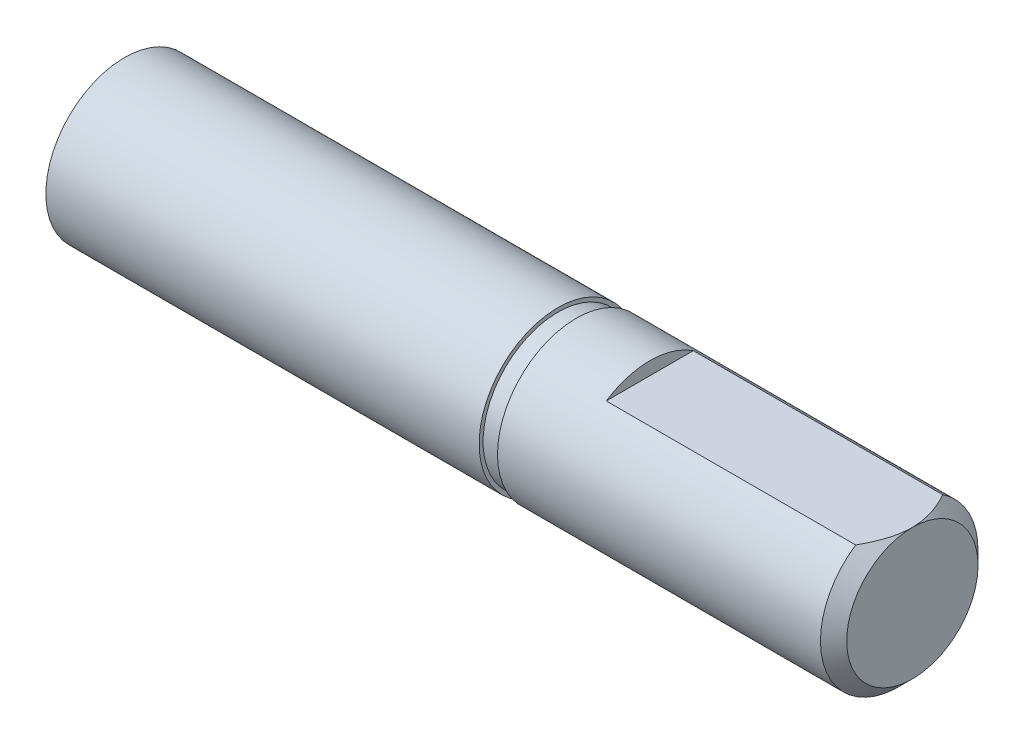
ISO-10303-21;
HEADER;
FILE_DESCRIPTION(('STEP AP214'),'2;1');
FILE_NAME('part.step','',(''),(''),'','','');
FILE_SCHEMA(('AUTOMOTIVE_DESIGN { 1 0 10303 214 1 1 1 1 }'));
ENDSEC;
DATA;
#1=APPLICATION_CONTEXT('core data for automotive mechanical design processes');
#2=APPLICATION_PROTOCOL_DEFINITION('international standard','automotive_design',2000,#1);
#3=PRODUCT_CONTEXT('',#1,'mechanical');
#4=PRODUCT('Part','Part','',(#3));
#5=PRODUCT_RELATED_PRODUCT_CATEGORY('part','',(#4));
#6=PRODUCT_DEFINITION_FORMATION('','',#4);
#7=PRODUCT_DEFINITION_CONTEXT('part definition',#1,'design');
#8=PRODUCT_DEFINITION('design','',#6,#7);
#9=PRODUCT_DEFINITION_SHAPE('','',#8);
#10=(LENGTH_UNIT() NAMED_UNIT(*) SI_UNIT(.MILLI.,.METRE.));
#11=(NAMED_UNIT(*) PLANE_ANGLE_UNIT() SI_UNIT($,.RADIAN.));
#12=(NAMED_UNIT(*) SI_UNIT($,.STERADIAN.) SOLID_ANGLE_UNIT());
#13=UNCERTAINTY_MEASURE_WITH_UNIT(LENGTH_MEASURE(1.E-05),#10,'distance_accuracy_value','');
#14=(GEOMETRIC_REPRESENTATION_CONTEXT(3) GLOBAL_UNCERTAINTY_ASSIGNED_CONTEXT((#13)) GLOBAL_UNIT_ASSIGNED_CONTEXT((#10,
#11,#12)) REPRESENTATION_CONTEXT('',''));
#15=CARTESIAN_POINT('',(0.,0.,0.));
#16=DIRECTION('',(0.,0.,1.));
#17=DIRECTION('',(1.,0.,0.));
#18=AXIS2_PLACEMENT_3D('',#15,#16,#17);
#19=CARTESIAN_POINT('',(-15.,0.,0.));
#20=DIRECTION('',(1.,0.,0.));
#21=DIRECTION('',(0.,0.,-1.));
#22=AXIS2_PLACEMENT_3D('',#19,#20,#21);
#23=CYLINDRICAL_SURFACE('',#22,3.);
#24=CARTESIAN_POINT('',(-15.,0.,0.));
#25=DIRECTION('',(1.,0.,0.));
#26=DIRECTION('',(0.,0.,-1.));
#27=AXIS2_PLACEMENT_3D('',#24,#25,#26);
#28=CIRCLE('',#27,3.);
#29=CARTESIAN_POINT('',(-15.,0.,-3.));
#30=VERTEX_POINT('',#29);
#31=EDGE_CURVE('E71',#30,#30,#28,.T.);
#32=ORIENTED_EDGE('',*,*,#31,.T.);
#33=EDGE_LOOP('',(#32));
#34=FACE_BOUND('',#33,.T.);
#35=CARTESIAN_POINT('',(1.5,0.,0.));
#36=DIRECTION('',(1.,0.,0.));
#37=DIRECTION('',(0.,0.,-1.));
#38=AXIS2_PLACEMENT_3D('',#35,#36,#37);
#39=CIRCLE('',#38,3.);
#40=CARTESIAN_POINT('',(1.5,0.,-3.));
#41=VERTEX_POINT('',#40);
#42=EDGE_CURVE('E77',#41,#41,#39,.F.);
#43=ORIENTED_EDGE('',*,*,#42,.T.);
#44=EDGE_LOOP('',(#43));
#45=FACE_BOUND('',#44,.T.);
#46=ADVANCED_FACE('F33',(#34,#45),#23,.T.);
#47=CARTESIAN_POINT('',(-15.,0.,0.));
#48=DIRECTION('',(1.,0.,0.));
#49=DIRECTION('',(0.,0.,-1.));
#50=AXIS2_PLACEMENT_3D('',#47,#48,#49);
#51=PLANE('',#50);
#52=ORIENTED_EDGE('',*,*,#31,.F.);
#53=EDGE_LOOP('',(#52));
#54=FACE_BOUND('',#53,.T.);
#55=ADVANCED_FACE('F113',(#54),#51,.F.);
#56=CARTESIAN_POINT('',(-62.5,0.,0.));
#57=DIRECTION('',(1.,0.,0.));
#58=DIRECTION('',(0.,0.,-1.));
#59=AXIS2_PLACEMENT_3D('',#56,#57,#58);
#60=CYLINDRICAL_SURFACE('',#59,2.85000000000001);
#61=CARTESIAN_POINT('',(1.5,0.,0.));
#62=DIRECTION('',(1.,0.,0.));
#63=DIRECTION('',(0.,0.,-1.));
#64=AXIS2_PLACEMENT_3D('',#61,#62,#63);
#65=CIRCLE('',#64,2.85000000000001);
#66=CARTESIAN_POINT('',(1.5,0.,-2.85));
#67=VERTEX_POINT('',#66);
#68=EDGE_CURVE('E83',#67,#67,#65,.T.);
#69=ORIENTED_EDGE('',*,*,#68,.T.);
#70=EDGE_LOOP('',(#69));
#71=FACE_BOUND('',#70,.T.);
#72=CARTESIAN_POINT('',(2.20000000000001,0.,0.));
#73=DIRECTION('',(1.,0.,0.));
#74=DIRECTION('',(0.,0.,-1.));
#75=AXIS2_PLACEMENT_3D('',#72,#73,#74);
#76=CIRCLE('',#75,2.85000000000001);
#77=CARTESIAN_POINT('',(2.20000000000001,0.,-2.85));
#78=VERTEX_POINT('',#77);
#79=EDGE_CURVE('E201',#78,#78,#76,.T.);
#80=ORIENTED_EDGE('',*,*,#79,.F.);
#81=EDGE_LOOP('',(#80));
#82=FACE_BOUND('',#81,.T.);
#83=ADVANCED_FACE('F108',(#71,#82),#60,.T.);
#84=CARTESIAN_POINT('',(1.5,0.,-2.85));
#85=DIRECTION('',(1.,0.,0.));
#86=DIRECTION('',(0.,0.,-1.));
#87=AXIS2_PLACEMENT_3D('',#84,#85,#86);
#88=PLANE('',#87);
#89=ORIENTED_EDGE('',*,*,#42,.F.);
#90=EDGE_LOOP('',(#89));
#91=FACE_BOUND('',#90,.T.);
#92=ORIENTED_EDGE('',*,*,#68,.F.);
#93=EDGE_LOOP('',(#92));
#94=FACE_BOUND('',#93,.T.);
#95=ADVANCED_FACE('F162',(#91,#94),#88,.T.);
#96=CARTESIAN_POINT('',(2.2,0.,-3.6));
#97=DIRECTION('',(-1.,0.,0.));
#98=DIRECTION('',(0.,0.,1.));
#99=AXIS2_PLACEMENT_3D('',#96,#97,#98);
#100=PLANE('',#99);
#101=CARTESIAN_POINT('',(2.2,0.,0.));
#102=DIRECTION('',(-1.,0.,0.));
#103=DIRECTION('',(0.,0.,1.));
#104=AXIS2_PLACEMENT_3D('',#101,#102,#103);
#105=CIRCLE('',#104,3.);
#106=CARTESIAN_POINT('',(2.2,0.,3.));
#107=VERTEX_POINT('',#106);
#108=EDGE_CURVE('E80',#107,#107,#105,.F.);
#109=ORIENTED_EDGE('',*,*,#108,.F.);
#110=EDGE_LOOP('',(#109));
#111=FACE_BOUND('',#110,.T.);
#112=ORIENTED_EDGE('',*,*,#79,.T.);
#113=EDGE_LOOP('',(#112));
#114=FACE_BOUND('',#113,.T.);
#115=ADVANCED_FACE('F118',(#111,#114),#100,.T.);
#116=CARTESIAN_POINT('',(15.,0.,0.));
#117=DIRECTION('',(1.,0.,0.));
#118=DIRECTION('',(0.,0.,-1.));
#119=AXIS2_PLACEMENT_3D('',#116,#117,#118);
#120=PLANE('',#119);
#121=CARTESIAN_POINT('',(15.,0.,0.));
#122=DIRECTION('',(1.,0.,0.));
#123=DIRECTION('',(0.,0.,-1.));
#124=AXIS2_PLACEMENT_3D('',#121,#122,#123);
#125=CIRCLE('',#124,2.5);
#126=CARTESIAN_POINT('',(15.,2.5,0.));
#127=VERTEX_POINT('',#126);
#128=EDGE_CURVE('E70',#127,#127,#125,.T.);
#129=ORIENTED_EDGE('',*,*,#128,.T.);
#130=EDGE_LOOP('',(#129));
#131=FACE_BOUND('',#130,.T.);
#132=ADVANCED_FACE('F107',(#131),#120,.T.);
#133=CARTESIAN_POINT('',(0.,2.5,0.));
#134=DIRECTION('',(0.,1.,0.));
#135=DIRECTION('',(0.,0.,1.));
#136=AXIS2_PLACEMENT_3D('',#133,#134,#135);
#137=PLANE('',#136);
#138=CARTESIAN_POINT('',(14.5,2.5,1.6583123951777));
#139=CARTESIAN_POINT('',(14.5250200255843,2.5,1.61304419071273));
#140=CARTESIAN_POINT('',(14.5494994272189,2.5,1.56747781751027));
#141=CARTESIAN_POINT('',(14.5972096867305,2.5,1.47571363154993));
#142=CARTESIAN_POINT('',(14.6204409038781,2.5,1.42951600534284));
#143=CARTESIAN_POINT('',(14.688233741468,2.5,1.28946898250347));
#144=CARTESIAN_POINT('',(14.7306685534991,2.5,1.19456817295726));
#145=CARTESIAN_POINT('',(14.8071641313579,2.5,1.00435832661107));
#146=CARTESIAN_POINT('',(14.8414185932365,2.5,0.909128166857125));
#147=CARTESIAN_POINT('',(14.9011186383457,2.5,0.715960996402815));
#148=CARTESIAN_POINT('',(14.9265705213043,2.5,0.618025975916652));
#149=CARTESIAN_POINT('',(14.96395141614,2.5,0.434096531038016));
#150=CARTESIAN_POINT('',(14.9772928993308,2.5,0.348395131920407));
#151=CARTESIAN_POINT('',(14.9908266543301,2.5,0.218706232970872));
#152=CARTESIAN_POINT('',(14.9942588205655,2.5,0.175042274887084));
#153=CARTESIAN_POINT('',(14.9988484547413,2.5,0.0875881850217009));
#154=CARTESIAN_POINT('',(15.0000055502065,2.5,0.0437980337548238));
#155=CARTESIAN_POINT('',(15.,2.5,0.));
#156=B_SPLINE_CURVE_WITH_KNOTS('',3,(#138,#139,#140,#141,#142,#143,#144,#145,#146,#147,#148,
#149,#150,#151,#152,#153,#154,#155),.UNSPECIFIED.,.F.,.F.,(4,2,2,2,2,2,2,2,4),(0.,
0.155160114661542,0.31027532695393,0.621889187467563,0.925164565305225,1.22822244720192,
1.48798349653101,1.61932602447731,1.75069005406606),.UNSPECIFIED.);
#157=CARTESIAN_POINT('',(14.5,2.5,1.6583123951777));
#158=VERTEX_POINT('',#157);
#159=EDGE_CURVE('E93',#158,#127,#156,.T.);
#160=ORIENTED_EDGE('',*,*,#159,.T.);
#161=CARTESIAN_POINT('',(15.,2.5,0.));
#162=CARTESIAN_POINT('',(15.0000643176381,2.5,-0.0768428391803901));
#163=CARTESIAN_POINT('',(14.9964585669139,2.5,-0.153646619440303));
#164=CARTESIAN_POINT('',(14.9824138186157,2.5,-0.306486913990627));
#165=CARTESIAN_POINT('',(14.9719877566791,2.5,-0.382524604614587));
#166=CARTESIAN_POINT('',(14.9450231886171,2.5,-0.532231201598334));
#167=CARTESIAN_POINT('',(14.9285851348585,2.5,-0.605918543015116));
#168=CARTESIAN_POINT('',(14.8903277696489,2.5,-0.751897163106756));
#169=CARTESIAN_POINT('',(14.8685063602177,2.5,-0.82418788562464));
#170=CARTESIAN_POINT('',(14.8222417065684,2.5,-0.961361204559357));
#171=CARTESIAN_POINT('',(14.7981581621012,2.5,-1.02636662586386));
#172=CARTESIAN_POINT('',(14.7466971992364,2.5,-1.15505562355538));
#173=CARTESIAN_POINT('',(14.7193196398836,2.5,-1.21873914323976));
#174=CARTESIAN_POINT('',(14.6613450460911,2.5,-1.34581351001767));
#175=CARTESIAN_POINT('',(14.6307045192353,2.5,-1.40918435962136));
#176=CARTESIAN_POINT('',(14.567035036112,2.5,-1.53466113602633));
#177=CARTESIAN_POINT('',(14.5340077944289,2.5,-1.59676793059763));
#178=CARTESIAN_POINT('',(14.5,2.5,-1.6583123951777));
#179=B_SPLINE_CURVE_WITH_KNOTS('',3,(#161,#162,#163,#164,#165,#166,#167,#168,#169,#170,#171,
#172,#173,#174,#175,#176,#177,#178),.UNSPECIFIED.,.F.,.F.,(4,2,2,2,2,2,2,2,4),(0.,
0.230381722715162,0.460327757459291,0.686595219702814,0.912951001700745,1.12081935764499,
1.32869661170077,1.53981070703045,1.75077462023261),.UNSPECIFIED.);
#180=CARTESIAN_POINT('',(14.5,2.5,-1.6583123951777));
#181=VERTEX_POINT('',#180);
#182=EDGE_CURVE('E42',#127,#181,#179,.T.);
#183=ORIENTED_EDGE('',*,*,#182,.T.);
#184=DIRECTION('',(1.,0.,0.));
#185=VECTOR('',#184,1.);
#186=CARTESIAN_POINT('',(-15.,2.5,-1.6583123951777));
#187=LINE('',#186,#185);
#188=CARTESIAN_POINT('',(5.,2.5,-1.6583123951777));
#189=VERTEX_POINT('',#188);
#190=EDGE_CURVE('E65',#189,#181,#187,.T.);
#191=ORIENTED_EDGE('',*,*,#190,.F.);
#192=DIRECTION('',(0.,0.,1.));
#193=VECTOR('',#192,1.);
#194=CARTESIAN_POINT('',(5.,2.5,-3.));
#195=LINE('',#194,#193);
#196=CARTESIAN_POINT('',(5.,2.5,1.6583123951777));
#197=VERTEX_POINT('',#196);
#198=EDGE_CURVE('E74',#189,#197,#195,.T.);
#199=ORIENTED_EDGE('',*,*,#198,.T.);
#200=DIRECTION('',(1.,0.,0.));
#201=VECTOR('',#200,1.);
#202=CARTESIAN_POINT('',(-15.,2.5,1.6583123951777));
#203=LINE('',#202,#201);
#204=EDGE_CURVE('E66',#158,#197,#203,.F.);
#205=ORIENTED_EDGE('',*,*,#204,.F.);
#206=EDGE_LOOP('',(#160,#183,#191,#199,#205));
#207=FACE_BOUND('',#206,.T.);
#208=ADVANCED_FACE('F73',(#207),#137,.T.);
#209=CARTESIAN_POINT('',(5.,2.5,-3.));
#210=DIRECTION('',(-1.,0.,0.));
#211=DIRECTION('',(0.,0.,1.));
#212=AXIS2_PLACEMENT_3D('',#209,#210,#211);
#213=PLANE('',#212);
#214=ORIENTED_EDGE('',*,*,#198,.F.);
#215=CARTESIAN_POINT('',(5.,0.,0.));
#216=DIRECTION('',(-1.,0.,0.));
#217=DIRECTION('',(0.,0.,1.));
#218=AXIS2_PLACEMENT_3D('',#215,#216,#217);
#219=CIRCLE('',#218,3.);
#220=EDGE_CURVE('E62',#189,#197,#219,.F.);
#221=ORIENTED_EDGE('',*,*,#220,.T.);
#222=EDGE_LOOP('',(#214,#221));
#223=FACE_BOUND('',#222,.T.);
#224=ADVANCED_FACE('F76',(#223),#213,.F.);
#225=ORIENTED_EDGE('',*,*,#190,.T.);
#226=CARTESIAN_POINT('',(14.5,0.,0.));
#227=DIRECTION('',(1.,0.,0.));
#228=DIRECTION('',(0.,0.,-1.));
#229=AXIS2_PLACEMENT_3D('',#226,#227,#228);
#230=CIRCLE('',#229,3.);
#231=EDGE_CURVE('E11',#181,#158,#230,.F.);
#232=ORIENTED_EDGE('',*,*,#231,.T.);
#233=ORIENTED_EDGE('',*,*,#204,.T.);
#234=ORIENTED_EDGE('',*,*,#220,.F.);
#235=EDGE_LOOP('',(#225,#232,#233,#234));
#236=FACE_BOUND('',#235,.T.);
#237=ORIENTED_EDGE('',*,*,#108,.T.);
#238=EDGE_LOOP('',(#237));
#239=FACE_BOUND('',#238,.T.);
#240=ADVANCED_FACE('F63',(#236,#239),#23,.T.);
#241=CARTESIAN_POINT('',(15.,0.,0.));
#242=DIRECTION('',(-1.,0.,0.));
#243=DIRECTION('',(0.,0.,1.));
#244=AXIS2_PLACEMENT_3D('',#241,#242,#243);
#245=CONICAL_SURFACE('',#244,2.5,0.785398163397442);
#246=ORIENTED_EDGE('',*,*,#159,.F.);
#247=ORIENTED_EDGE('',*,*,#231,.F.);
#248=ORIENTED_EDGE('',*,*,#182,.F.);
#249=ORIENTED_EDGE('',*,*,#128,.F.);
#250=EDGE_LOOP('',(#246,#247,#248,#249));
#251=FACE_BOUND('',#250,.T.);
#252=ADVANCED_FACE('F35',(#251),#245,.T.);
#253=CLOSED_SHELL('',(#46,#55,#83,#95,#115,#132,#208,#224,#240,#252));
#254=MANIFOLD_SOLID_BREP('B2',#253);
#255=ADVANCED_BREP_SHAPE_REPRESENTATION('',(#18,#254),#14);
#256=SHAPE_DEFINITION_REPRESENTATION(#9,#255);
ENDSEC;
END-ISO-10303-21;
